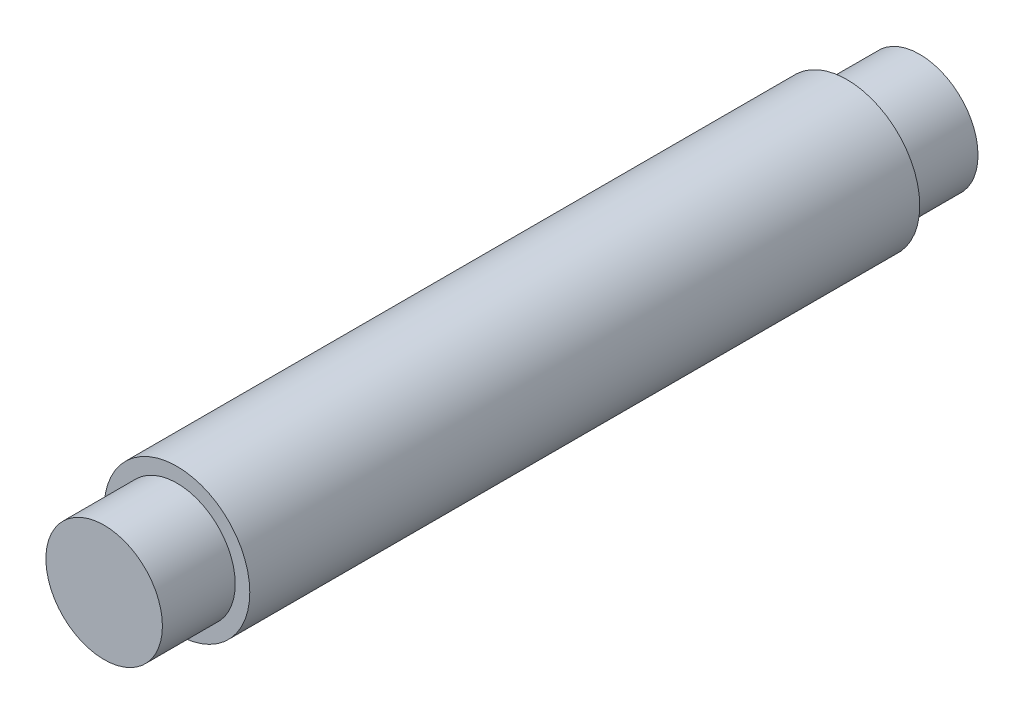
ISO-10303-21;
HEADER;
FILE_DESCRIPTION(('STEP AP214'),'2;1');
FILE_NAME('part.step','',(''),(''),'','','');
FILE_SCHEMA(('AUTOMOTIVE_DESIGN { 1 0 10303 214 1 1 1 1 }'));
ENDSEC;
DATA;
#1=APPLICATION_CONTEXT('core data for automotive mechanical design processes');
#2=APPLICATION_PROTOCOL_DEFINITION('international standard','automotive_design',2000,#1);
#3=PRODUCT_CONTEXT('',#1,'mechanical');
#4=PRODUCT('Part','Part','',(#3));
#5=PRODUCT_RELATED_PRODUCT_CATEGORY('part','',(#4));
#6=PRODUCT_DEFINITION_FORMATION('','',#4);
#7=PRODUCT_DEFINITION_CONTEXT('part definition',#1,'design');
#8=PRODUCT_DEFINITION('design','',#6,#7);
#9=PRODUCT_DEFINITION_SHAPE('','',#8);
#10=(LENGTH_UNIT() NAMED_UNIT(*) SI_UNIT(.MILLI.,.METRE.));
#11=(NAMED_UNIT(*) PLANE_ANGLE_UNIT() SI_UNIT($,.RADIAN.));
#12=(NAMED_UNIT(*) SI_UNIT($,.STERADIAN.) SOLID_ANGLE_UNIT());
#13=UNCERTAINTY_MEASURE_WITH_UNIT(LENGTH_MEASURE(1.E-05),#10,'distance_accuracy_value','');
#14=(GEOMETRIC_REPRESENTATION_CONTEXT(3) GLOBAL_UNCERTAINTY_ASSIGNED_CONTEXT((#13)) GLOBAL_UNIT_ASSIGNED_CONTEXT((#10,
#11,#12)) REPRESENTATION_CONTEXT('',''));
#15=CARTESIAN_POINT('',(0.,0.,0.));
#16=DIRECTION('',(0.,0.,1.));
#17=DIRECTION('',(1.,0.,0.));
#18=AXIS2_PLACEMENT_3D('',#15,#16,#17);
#19=CARTESIAN_POINT('',(0.,0.,23.));
#20=DIRECTION('',(0.,0.,-1.));
#21=DIRECTION('',(-1.,0.,0.));
#22=AXIS2_PLACEMENT_3D('',#19,#20,#21);
#23=CYLINDRICAL_SURFACE('',#22,2.5);
#24=CARTESIAN_POINT('',(0.,0.,23.));
#25=DIRECTION('',(0.,0.,1.));
#26=DIRECTION('',(1.,0.,0.));
#27=AXIS2_PLACEMENT_3D('',#24,#25,#26);
#28=CIRCLE('',#27,2.5);
#29=CARTESIAN_POINT('',(2.5,0.,23.));
#30=VERTEX_POINT('',#29);
#31=EDGE_CURVE('E41',#30,#30,#28,.T.);
#32=ORIENTED_EDGE('',*,*,#31,.F.);
#33=EDGE_LOOP('',(#32));
#34=FACE_BOUND('',#33,.T.);
#35=CARTESIAN_POINT('',(0.,0.,0.));
#36=DIRECTION('',(0.,0.,1.));
#37=DIRECTION('',(1.,0.,0.));
#38=AXIS2_PLACEMENT_3D('',#35,#36,#37);
#39=CIRCLE('',#38,2.5);
#40=CARTESIAN_POINT('',(2.5,0.,0.));
#41=VERTEX_POINT('',#40);
#42=EDGE_CURVE('E45',#41,#41,#39,.T.);
#43=ORIENTED_EDGE('',*,*,#42,.T.);
#44=EDGE_LOOP('',(#43));
#45=FACE_BOUND('',#44,.T.);
#46=ADVANCED_FACE('F35',(#34,#45),#23,.T.);
#47=CARTESIAN_POINT('',(0.,0.,23.));
#48=DIRECTION('',(0.,0.,1.));
#49=DIRECTION('',(1.,0.,0.));
#50=AXIS2_PLACEMENT_3D('',#47,#48,#49);
#51=PLANE('',#50);
#52=CARTESIAN_POINT('',(0.,0.,23.));
#53=DIRECTION('',(0.,0.,1.));
#54=DIRECTION('',(1.,0.,0.));
#55=AXIS2_PLACEMENT_3D('',#52,#53,#54);
#56=CIRCLE('',#55,2.);
#57=CARTESIAN_POINT('',(2.,0.,23.));
#58=VERTEX_POINT('',#57);
#59=EDGE_CURVE('E52',#58,#58,#56,.T.);
#60=ORIENTED_EDGE('',*,*,#59,.F.);
#61=EDGE_LOOP('',(#60));
#62=FACE_BOUND('',#61,.T.);
#63=ORIENTED_EDGE('',*,*,#31,.T.);
#64=EDGE_LOOP('',(#63));
#65=FACE_BOUND('',#64,.T.);
#66=ADVANCED_FACE('F76',(#62,#65),#51,.T.);
#67=CARTESIAN_POINT('',(0.,0.,0.));
#68=DIRECTION('',(0.,0.,1.));
#69=DIRECTION('',(1.,0.,0.));
#70=AXIS2_PLACEMENT_3D('',#67,#68,#69);
#71=PLANE('',#70);
#72=CARTESIAN_POINT('',(0.,0.,0.));
#73=DIRECTION('',(0.,0.,1.));
#74=DIRECTION('',(1.,0.,0.));
#75=AXIS2_PLACEMENT_3D('',#72,#73,#74);
#76=CIRCLE('',#75,2.);
#77=CARTESIAN_POINT('',(2.,0.,0.));
#78=VERTEX_POINT('',#77);
#79=EDGE_CURVE('E10',#78,#78,#76,.F.);
#80=ORIENTED_EDGE('',*,*,#79,.F.);
#81=EDGE_LOOP('',(#80));
#82=FACE_BOUND('',#81,.T.);
#83=ORIENTED_EDGE('',*,*,#42,.F.);
#84=EDGE_LOOP('',(#83));
#85=FACE_BOUND('',#84,.T.);
#86=ADVANCED_FACE('F81',(#82,#85),#71,.F.);
#87=CARTESIAN_POINT('',(0.,0.,25.5));
#88=DIRECTION('',(0.,0.,-1.));
#89=DIRECTION('',(-1.,0.,0.));
#90=AXIS2_PLACEMENT_3D('',#87,#88,#89);
#91=CYLINDRICAL_SURFACE('',#90,2.);
#92=CARTESIAN_POINT('',(0.,0.,25.5));
#93=DIRECTION('',(0.,0.,1.));
#94=DIRECTION('',(1.,0.,0.));
#95=AXIS2_PLACEMENT_3D('',#92,#93,#94);
#96=CIRCLE('',#95,2.);
#97=CARTESIAN_POINT('',(2.,0.,25.5));
#98=VERTEX_POINT('',#97);
#99=EDGE_CURVE('E50',#98,#98,#96,.T.);
#100=ORIENTED_EDGE('',*,*,#99,.F.);
#101=EDGE_LOOP('',(#100));
#102=FACE_BOUND('',#101,.T.);
#103=ORIENTED_EDGE('',*,*,#59,.T.);
#104=EDGE_LOOP('',(#103));
#105=FACE_BOUND('',#104,.T.);
#106=ADVANCED_FACE('F72',(#102,#105),#91,.T.);
#107=CARTESIAN_POINT('',(0.,0.,25.5));
#108=DIRECTION('',(0.,0.,1.));
#109=DIRECTION('',(1.,0.,0.));
#110=AXIS2_PLACEMENT_3D('',#107,#108,#109);
#111=PLANE('',#110);
#112=ORIENTED_EDGE('',*,*,#99,.T.);
#113=EDGE_LOOP('',(#112));
#114=FACE_BOUND('',#113,.T.);
#115=ADVANCED_FACE('F65',(#114),#111,.T.);
#116=CARTESIAN_POINT('',(0.,0.,-2.5));
#117=DIRECTION('',(0.,0.,1.));
#118=DIRECTION('',(1.,0.,0.));
#119=AXIS2_PLACEMENT_3D('',#116,#117,#118);
#120=CYLINDRICAL_SURFACE('',#119,2.);
#121=CARTESIAN_POINT('',(0.,0.,-2.5));
#122=DIRECTION('',(0.,0.,-1.));
#123=DIRECTION('',(-1.,0.,0.));
#124=AXIS2_PLACEMENT_3D('',#121,#122,#123);
#125=CIRCLE('',#124,2.);
#126=CARTESIAN_POINT('',(-2.,0.,-2.5));
#127=VERTEX_POINT('',#126);
#128=EDGE_CURVE('E55',#127,#127,#125,.T.);
#129=ORIENTED_EDGE('',*,*,#128,.F.);
#130=EDGE_LOOP('',(#129));
#131=FACE_BOUND('',#130,.T.);
#132=ORIENTED_EDGE('',*,*,#79,.T.);
#133=EDGE_LOOP('',(#132));
#134=FACE_BOUND('',#133,.T.);
#135=ADVANCED_FACE('F63',(#131,#134),#120,.T.);
#136=CARTESIAN_POINT('',(0.,0.,-2.5));
#137=DIRECTION('',(0.,0.,-1.));
#138=DIRECTION('',(-1.,0.,0.));
#139=AXIS2_PLACEMENT_3D('',#136,#137,#138);
#140=PLANE('',#139);
#141=ORIENTED_EDGE('',*,*,#128,.T.);
#142=EDGE_LOOP('',(#141));
#143=FACE_BOUND('',#142,.T.);
#144=ADVANCED_FACE('F61',(#143),#140,.T.);
#145=CLOSED_SHELL('',(#46,#66,#86,#106,#115,#135,#144));
#146=MANIFOLD_SOLID_BREP('B2',#145);
#147=ADVANCED_BREP_SHAPE_REPRESENTATION('',(#18,#146),#14);
#148=SHAPE_DEFINITION_REPRESENTATION(#9,#147);
ENDSEC;
END-ISO-10303-21;
